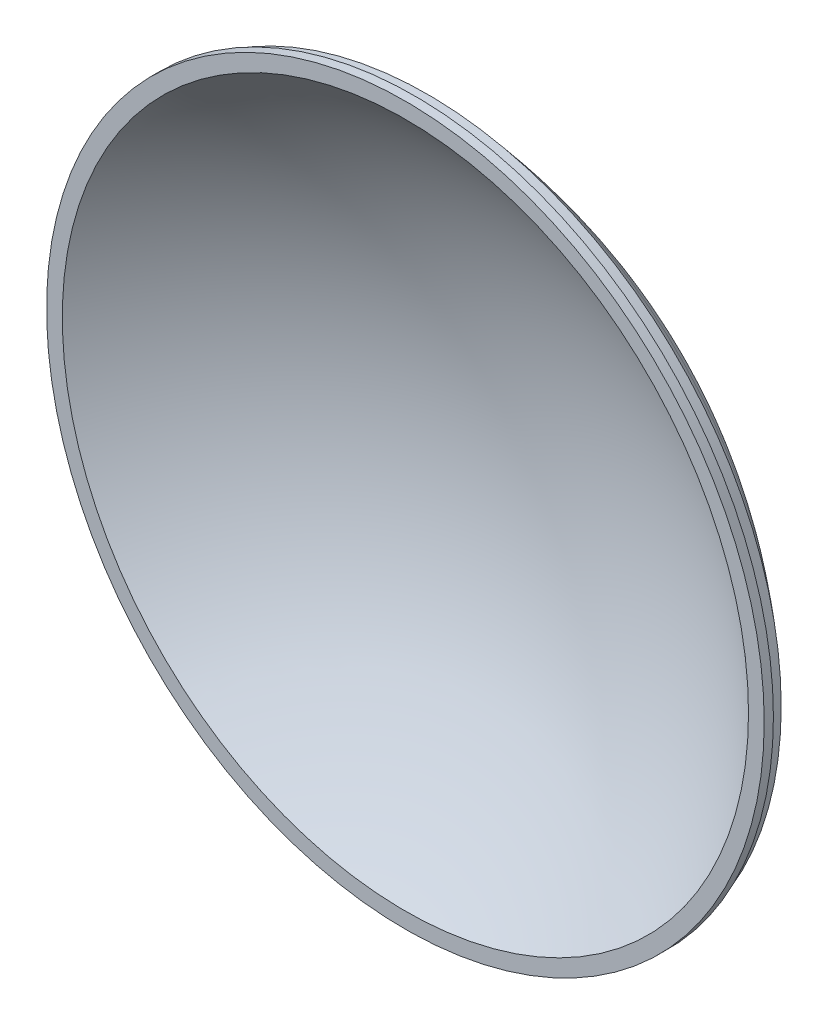
ISO-10303-21;
HEADER;
FILE_DESCRIPTION(('STEP AP214'),'2;1');
FILE_NAME('part.step','',(''),(''),'','','');
FILE_SCHEMA(('AUTOMOTIVE_DESIGN { 1 0 10303 214 1 1 1 1 }'));
ENDSEC;
DATA;
#1=APPLICATION_CONTEXT('core data for automotive mechanical design processes');
#2=APPLICATION_PROTOCOL_DEFINITION('international standard','automotive_design',2000,#1);
#3=PRODUCT_CONTEXT('',#1,'mechanical');
#4=PRODUCT('Part','Part','',(#3));
#5=PRODUCT_RELATED_PRODUCT_CATEGORY('part','',(#4));
#6=PRODUCT_DEFINITION_FORMATION('','',#4);
#7=PRODUCT_DEFINITION_CONTEXT('part definition',#1,'design');
#8=PRODUCT_DEFINITION('design','',#6,#7);
#9=PRODUCT_DEFINITION_SHAPE('','',#8);
#10=(LENGTH_UNIT() NAMED_UNIT(*) SI_UNIT(.MILLI.,.METRE.));
#11=(NAMED_UNIT(*) PLANE_ANGLE_UNIT() SI_UNIT($,.RADIAN.));
#12=(NAMED_UNIT(*) SI_UNIT($,.STERADIAN.) SOLID_ANGLE_UNIT());
#13=UNCERTAINTY_MEASURE_WITH_UNIT(LENGTH_MEASURE(1.E-05),#10,'distance_accuracy_value','');
#14=(GEOMETRIC_REPRESENTATION_CONTEXT(3) GLOBAL_UNCERTAINTY_ASSIGNED_CONTEXT((#13)) GLOBAL_UNIT_ASSIGNED_CONTEXT((#10,
#11,#12)) REPRESENTATION_CONTEXT('',''));
#15=CARTESIAN_POINT('',(0.,0.,0.));
#16=DIRECTION('',(0.,0.,1.));
#17=DIRECTION('',(1.,0.,0.));
#18=AXIS2_PLACEMENT_3D('',#15,#16,#17);
#19=CARTESIAN_POINT('',(-0.00808342164455528,0.,-15.7384787130482));
#20=CARTESIAN_POINT('',(0.285711550400135,0.,-15.7386296087402));
#21=CARTESIAN_POINT('',(0.840812887994604,0.,-15.7380042311343));
#22=CARTESIAN_POINT('',(1.86839450770145,0.,-15.7345463168751));
#23=CARTESIAN_POINT('',(2.90117342896609,0.,-15.7283815243453));
#24=CARTESIAN_POINT('',(4.227582271224,0.,-15.7164418039564));
#25=CARTESIAN_POINT('',(5.82141805374745,0.,-15.6948413503107));
#26=CARTESIAN_POINT('',(8.41616018120487,0.,-15.6460508587562));
#27=CARTESIAN_POINT('',(11.658122447958,0.,-15.5579879631397));
#28=CARTESIAN_POINT('',(16.8400773096723,0.,-15.3597838396346));
#29=CARTESIAN_POINT('',(23.3132004190147,0.,-15.0041791779577));
#30=CARTESIAN_POINT('',(33.6570124502994,0.,-14.205024156525));
#31=CARTESIAN_POINT('',(46.5503731882834,0.,-12.7737413367269));
#32=CARTESIAN_POINT('',(77.3172274254475,0.,-7.95622569788989));
#33=CARTESIAN_POINT('',(122.569414069781,0.,4.47935452639081));
#34=CARTESIAN_POINT('',(169.462252378607,0.,27.1431193091703));
#35=CARTESIAN_POINT('',(204.131428921085,0.,49.8057143075793));
#36=CARTESIAN_POINT('',(220.433111859137,0.,62.4430943957915));
#37=CARTESIAN_POINT('',(228.340910699695,0.,69.0609664377955));
#38=B_SPLINE_CURVE_WITH_KNOTS('',3,(#19,#20,#21,#22,#23,#24,#25,#26,#27,#28,#29,#30,#31,#32,#33,
#34,#35,#36,#37),.UNSPECIFIED.,.F.,.F.,(4,1,1,1,1,1,1,1,1,1,1,1,1,1,1,1,4),(0.0598426465342944,
0.0612287713283862,0.0626148961224781,0.0640010209165699,0.0653871457106617,0.0681593952988454,
0.070931644887029,0.0764761440633964,0.0820206432397637,0.0931096415924983,0.104198639945233,
0.126376636650702,0.148554633356172,0.237266620178049,0.325978606999926,0.370334600410865,
0.414690593821803),.UNSPECIFIED.);
#39=CARTESIAN_POINT('',(0.,0.,0.));
#40=DIRECTION('',(0.000513608762686487,0.,0.999999868103011));
#41=AXIS1_PLACEMENT('',#39,#40);
#42=SURFACE_OF_REVOLUTION('',#38,#41);
#43=CARTESIAN_POINT('',(0.0355305477969376,0.,69.1782260970762));
#44=DIRECTION('',(0.000513608762686487,0.,0.999999868103011));
#45=DIRECTION('',(0.999999868103011,0.,-0.000513608762686487));
#46=AXIS2_PLACEMENT_3D('',#43,#44,#45);
#47=CIRCLE('',#46,228.305410264695);
#48=CARTESIAN_POINT('',(228.340910699695,0.,69.0609664377955));
#49=VERTEX_POINT('',#48);
#50=EDGE_CURVE('E58',#49,#49,#47,.T.);
#51=ORIENTED_EDGE('',*,*,#50,.F.);
#52=EDGE_LOOP('',(#51));
#53=FACE_BOUND('',#52,.T.);
#54=CARTESIAN_POINT('',(-0.00808342164455528,0.,-15.7384787130482));
#55=VERTEX_POINT('',#54);
#56=VERTEX_LOOP('',#55);
#57=FACE_BOUND('',#56,.T.);
#58=ADVANCED_FACE('F34',(#53,#57),#42,.T.);
#59=CARTESIAN_POINT('',(2.44037014446134E-08,0.,-1.25365574844214E-11));
#60=CARTESIAN_POINT('',(0.2669396483553,0.,-0.000137102550776945));
#61=CARTESIAN_POINT('',(0.667468659346041,0.,0.000237150781999078));
#62=CARTESIAN_POINT('',(1.30949440444503,0.,0.00184074954092038));
#63=CARTESIAN_POINT('',(2.31330263670645,0.,0.00654568176315976));
#64=CARTESIAN_POINT('',(3.29773293225704,0.,0.0135812788263848));
#65=CARTESIAN_POINT('',(4.68644648266086,0.,0.0285318406281157));
#66=CARTESIAN_POINT('',(6.54750166145652,0.,0.0577472359735337));
#67=CARTESIAN_POINT('',(8.74336208969105,0.,0.105365618412597));
#68=CARTESIAN_POINT('',(11.2327349756059,0.,0.178382225522041));
#69=CARTESIAN_POINT('',(13.7315962328823,0.,0.269986288583971));
#70=CARTESIAN_POINT('',(16.224459485127,0.,0.380192602302218));
#71=CARTESIAN_POINT('',(18.7191999553068,0.,0.509003641883434));
#72=CARTESIAN_POINT('',(21.2114358216858,0.,0.65642783067275));
#73=CARTESIAN_POINT('',(23.7032867227949,0.,0.822469842539611));
#74=CARTESIAN_POINT('',(26.1934063559994,0.,1.00713566269371));
#75=CARTESIAN_POINT('',(28.6822987219983,0.,1.21042982783417));
#76=CARTESIAN_POINT('',(31.1694795436306,0.,1.43235676705014));
#77=CARTESIAN_POINT('',(33.6549900269759,0.,1.67291998607677));
#78=CARTESIAN_POINT('',(36.1385938813175,0.,1.93212240126991));
#79=CARTESIAN_POINT('',(41.7222018195495,0.,2.55727098872714));
#80=CARTESIAN_POINT('',(50.3876443843596,0.,3.7037195743151));
#81=CARTESIAN_POINT('',(62.0932548489539,0.,5.64337301230359));
#82=CARTESIAN_POINT('',(76.7526279362848,0.,8.76319199273064));
#83=CARTESIAN_POINT('',(90.0458325196116,0.,12.2336054527384));
#84=CARTESIAN_POINT('',(101.990970719461,0.,15.8771696300947));
#85=CARTESIAN_POINT('',(112.617146491669,0.,19.5364668848636));
#86=CARTESIAN_POINT('',(121.959235078501,0.,23.0751841783094));
#87=CARTESIAN_POINT('',(131.189699299355,0.,26.8955953873231));
#88=CARTESIAN_POINT('',(140.300737442644,0.,30.9926413314149));
#89=CARTESIAN_POINT('',(151.531134831127,0.,36.4524889900499));
#90=CARTESIAN_POINT('',(164.740762145625,0.,43.5329699748767));
#91=CARTESIAN_POINT('',(179.736348642118,0.,52.5330978068164));
#92=CARTESIAN_POINT('',(196.267376585222,0.,63.7668506984579));
#93=CARTESIAN_POINT('',(211.734779433093,0.,75.5465174552405));
#94=CARTESIAN_POINT('',(222.77914299991,0.,84.8558876399682));
#95=CARTESIAN_POINT('',(229.811527513237,0.,91.1622523367175));
#96=CARTESIAN_POINT('',(233.083010181632,0.,94.1800000003994));
#97=B_SPLINE_CURVE_WITH_KNOTS('',4,(#59,#60,#61,#62,#63,#64,#65,#66,#67,#68,#69,#70,#71,#72,#73,
#74,#75,#76,#77,#78,#79,#80,#81,#82,#83,#84,#85,#86,#87,#88,#89,#90,#91,#92,#93,#94,#95,#96),
.UNSPECIFIED.,.F.,.F.,(5,1,1,1,1,1,1,1,1,1,1,1,1,1,1,1,1,1,1,1,1,1,1,1,1,1,1,1,1,1,1,1,1,1,5),
(0.0598426465335932,0.0617060676969644,0.062637778257005,0.0635694888170457,0.065432909937127,
0.0672963310572083,0.0710231732973709,0.0747500155375335,0.0784768577776961,0.0822037000178587,
0.0859305422580213,0.0896573844981839,0.0933842248272017,0.0971110651562195,0.100837905485237,
0.104564745814255,0.108291586143273,0.112018426472291,0.115745266801308,0.119472107130326,
0.141833166511082,0.164194230486803,0.186555296265154,0.208916361053799,0.223823700452541,
0.238731039851284,0.253638401058811,0.268545762266338,0.283453152011756,0.298360541757175,
0.3281753089901,0.35798998959057,0.387804637643435,0.417619438226978,0.444190198020145),.UNSPECIFIED.);
#98=CARTESIAN_POINT('',(0.,0.,0.));
#99=DIRECTION('',(0.000513608762686487,0.,0.999999868103011));
#100=AXIS1_PLACEMENT('',#98,#99);
#101=SURFACE_OF_REVOLUTION('',#97,#100);
#102=CARTESIAN_POINT('',(0.0484331527802581,0.,94.2996886165573));
#103=DIRECTION('',(0.000513608762686487,0.,0.999999868103011));
#104=DIRECTION('',(0.999999868103011,0.,-0.000513608762686487));
#105=AXIS2_PLACEMENT_3D('',#102,#103,#104);
#106=CIRCLE('',#105,233.034607764982);
#107=CARTESIAN_POINT('',(233.083010181199,0.,94.18));
#108=VERTEX_POINT('',#107);
#109=EDGE_CURVE('E11',#108,#108,#106,.T.);
#110=ORIENTED_EDGE('',*,*,#109,.T.);
#111=EDGE_LOOP('',(#110));
#112=FACE_BOUND('',#111,.T.);
#113=CARTESIAN_POINT('',(0.,0.,0.));
#114=VERTEX_POINT('',#113);
#115=VERTEX_LOOP('',#114);
#116=FACE_BOUND('',#115,.T.);
#117=ADVANCED_FACE('F49',(#112,#116),#101,.F.);
#118=CARTESIAN_POINT('',(0.0484331527802581,0.,94.2996886165573));
#119=DIRECTION('',(0.000513608762686487,0.,0.999999868103011));
#120=DIRECTION('',(0.999999868103011,0.,-0.000513608762686487));
#121=AXIS2_PLACEMENT_3D('',#118,#119,#120);
#122=CONICAL_SURFACE('',#121,233.034607764982,1.57028271800963);
#123=CARTESIAN_POINT('',(0.0484359674618231,0.,94.3051688213324));
#124=DIRECTION('',(0.000513608762686487,0.,0.999999868103011));
#125=DIRECTION('',(0.999999868103011,0.,-0.000513608762686487));
#126=AXIS2_PLACEMENT_3D('',#123,#124,#125);
#127=CIRCLE('',#126,243.704606357641);
#128=CARTESIAN_POINT('',(243.753010181199,0.,94.18));
#129=VERTEX_POINT('',#128);
#130=EDGE_CURVE('E42',#129,#129,#127,.T.);
#131=ORIENTED_EDGE('',*,*,#130,.T.);
#132=EDGE_LOOP('',(#131));
#133=FACE_BOUND('',#132,.T.);
#134=ORIENTED_EDGE('',*,*,#109,.F.);
#135=EDGE_LOOP('',(#134));
#136=FACE_BOUND('',#135,.T.);
#137=ADVANCED_FACE('F54',(#133,#136),#122,.F.);
#138=CARTESIAN_POINT('',(0.0484359674618231,0.,94.3051688213324));
#139=DIRECTION('',(-0.000513608762686487,0.,-0.999999868103011));
#140=DIRECTION('',(-0.999999868103011,0.,0.000513608762686487));
#141=AXIS2_PLACEMENT_3D('',#138,#139,#140);
#142=CONICAL_SURFACE('',#141,243.704606357641,0.000513608785270061);
#143=CARTESIAN_POINT('',(0.0452259131184291,0.,88.0551704700446));
#144=DIRECTION('',(0.000513608762686487,0.,0.999999868103011));
#145=DIRECTION('',(0.999999868103011,0.,-0.000513608762686487));
#146=AXIS2_PLACEMENT_3D('',#143,#144,#145);
#147=CIRCLE('',#146,243.707816412408);
#148=CARTESIAN_POINT('',(243.753010181199,0.,87.93));
#149=VERTEX_POINT('',#148);
#150=EDGE_CURVE('E72',#149,#149,#147,.T.);
#151=ORIENTED_EDGE('',*,*,#150,.T.);
#152=EDGE_LOOP('',(#151));
#153=FACE_BOUND('',#152,.T.);
#154=ORIENTED_EDGE('',*,*,#130,.F.);
#155=EDGE_LOOP('',(#154));
#156=FACE_BOUND('',#155,.T.);
#157=ADVANCED_FACE('F79',(#153,#156),#142,.T.);
#158=CARTESIAN_POINT('',(0.0452259131184291,0.,88.0551704700446));
#159=DIRECTION('',(0.000513608762686487,0.,0.999999868103011));
#160=DIRECTION('',(0.999999868103011,0.,-0.000513608762686487));
#161=AXIS2_PLACEMENT_3D('',#158,#159,#160);
#162=CONICAL_SURFACE('',#161,243.707816412408,1.57028271800963);
#163=CARTESIAN_POINT('',(0.0452250162189613,0.,88.0534242004818));
#164=DIRECTION('',(0.000513608762686487,0.,0.999999868103011));
#165=DIRECTION('',(0.999999868103011,0.,-0.000513608762686487));
#166=AXIS2_PLACEMENT_3D('',#163,#164,#165);
#167=CIRCLE('',#166,240.307816860857);
#168=CARTESIAN_POINT('',(240.353010181199,0.,87.93));
#169=VERTEX_POINT('',#168);
#170=EDGE_CURVE('E63',#169,#169,#167,.T.);
#171=ORIENTED_EDGE('',*,*,#170,.T.);
#172=EDGE_LOOP('',(#171));
#173=FACE_BOUND('',#172,.T.);
#174=ORIENTED_EDGE('',*,*,#150,.F.);
#175=EDGE_LOOP('',(#174));
#176=FACE_BOUND('',#175,.T.);
#177=ADVANCED_FACE('F81',(#173,#176),#162,.T.);
#178=CARTESIAN_POINT('',(0.0452250162189613,0.,88.0534242004818));
#179=DIRECTION('',(-0.000513608762686487,0.,-0.999999868103011));
#180=DIRECTION('',(-0.999999868103011,0.,0.000513608762686487));
#181=AXIS2_PLACEMENT_3D('',#178,#179,#180);
#182=CONICAL_SURFACE('',#181,240.307816860857,0.000513608785265928);
#183=CARTESIAN_POINT('',(0.0407566205729569,0.,79.3534264954893));
#184=DIRECTION('',(0.000513608762686487,0.,0.999999868103011));
#185=DIRECTION('',(0.999999868103011,0.,-0.000513608762686487));
#186=AXIS2_PLACEMENT_3D('',#183,#184,#185);
#187=CIRCLE('',#186,240.312285257093);
#188=CARTESIAN_POINT('',(240.353010181199,0.,79.23));
#189=VERTEX_POINT('',#188);
#190=EDGE_CURVE('E60',#189,#189,#187,.T.);
#191=ORIENTED_EDGE('',*,*,#190,.T.);
#192=EDGE_LOOP('',(#191));
#193=FACE_BOUND('',#192,.T.);
#194=ORIENTED_EDGE('',*,*,#170,.F.);
#195=EDGE_LOOP('',(#194));
#196=FACE_BOUND('',#195,.T.);
#197=ADVANCED_FACE('F88',(#193,#196),#182,.T.);
#198=CARTESIAN_POINT('',(0.581974444842093,0.,1133.10833140247));
#199=DIRECTION('',(0.000513608762686487,0.,0.999999868103011));
#200=DIRECTION('',(0.999999868103011,0.,-0.000513608762686487));
#201=AXIS2_PLACEMENT_3D('',#198,#199,#200);
#202=DEGENERATE_TOROIDAL_SURFACE('',#201,663.00519346416,1387.94169902614,.F.);
#203=ORIENTED_EDGE('',*,*,#190,.F.);
#204=EDGE_LOOP('',(#203));
#205=FACE_BOUND('',#204,.T.);
#206=ORIENTED_EDGE('',*,*,#50,.T.);
#207=EDGE_LOOP('',(#206));
#208=FACE_BOUND('',#207,.T.);
#209=ADVANCED_FACE('F95',(#205,#208),#202,.F.);
#210=CLOSED_SHELL('',(#58,#117,#137,#157,#177,#197,#209));
#211=MANIFOLD_SOLID_BREP('B2',#210);
#212=ADVANCED_BREP_SHAPE_REPRESENTATION('',(#18,#211),#14);
#213=SHAPE_DEFINITION_REPRESENTATION(#9,#212);
ENDSEC;
END-ISO-10303-21;
